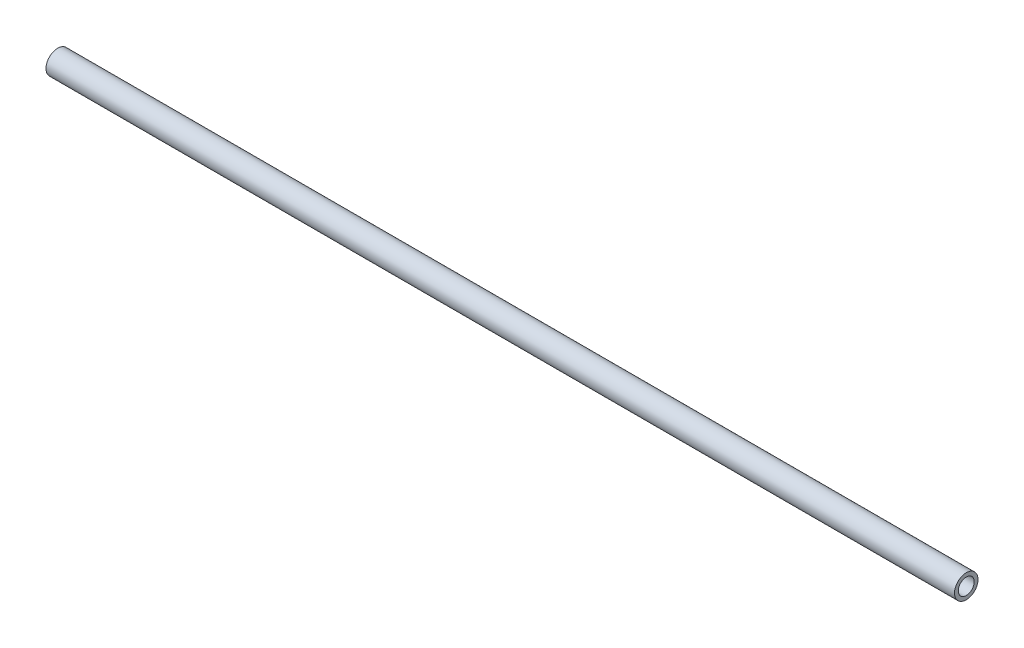
ISO-10303-21;
HEADER;
FILE_DESCRIPTION(('STEP AP214'),'2;1');
FILE_NAME('part.step','',(''),(''),'','','');
FILE_SCHEMA(('AUTOMOTIVE_DESIGN { 1 0 10303 214 1 1 1 1 }'));
ENDSEC;
DATA;
#1=APPLICATION_CONTEXT('core data for automotive mechanical design processes');
#2=APPLICATION_PROTOCOL_DEFINITION('international standard','automotive_design',2000,#1);
#3=PRODUCT_CONTEXT('',#1,'mechanical');
#4=PRODUCT('Part','Part','',(#3));
#5=PRODUCT_RELATED_PRODUCT_CATEGORY('part','',(#4));
#6=PRODUCT_DEFINITION_FORMATION('','',#4);
#7=PRODUCT_DEFINITION_CONTEXT('part definition',#1,'design');
#8=PRODUCT_DEFINITION('design','',#6,#7);
#9=PRODUCT_DEFINITION_SHAPE('','',#8);
#10=(LENGTH_UNIT() NAMED_UNIT(*) SI_UNIT(.MILLI.,.METRE.));
#11=(NAMED_UNIT(*) PLANE_ANGLE_UNIT() SI_UNIT($,.RADIAN.));
#12=(NAMED_UNIT(*) SI_UNIT($,.STERADIAN.) SOLID_ANGLE_UNIT());
#13=UNCERTAINTY_MEASURE_WITH_UNIT(LENGTH_MEASURE(1.E-05),#10,'distance_accuracy_value','');
#14=(GEOMETRIC_REPRESENTATION_CONTEXT(3) GLOBAL_UNCERTAINTY_ASSIGNED_CONTEXT((#13)) GLOBAL_UNIT_ASSIGNED_CONTEXT((#10,
#11,#12)) REPRESENTATION_CONTEXT('',''));
#15=CARTESIAN_POINT('',(0.,0.,0.));
#16=DIRECTION('',(0.,0.,1.));
#17=DIRECTION('',(1.,0.,0.));
#18=AXIS2_PLACEMENT_3D('',#15,#16,#17);
#19=CARTESIAN_POINT('',(-368.3,0.,0.));
#20=DIRECTION('',(1.,0.,0.));
#21=DIRECTION('',(0.,0.,-1.));
#22=AXIS2_PLACEMENT_3D('',#19,#20,#21);
#23=CYLINDRICAL_SURFACE('',#22,6.477);
#24=CARTESIAN_POINT('',(368.3,0.,0.));
#25=DIRECTION('',(1.,0.,0.));
#26=DIRECTION('',(0.,0.,-1.));
#27=AXIS2_PLACEMENT_3D('',#24,#25,#26);
#28=CIRCLE('',#27,6.477);
#29=CARTESIAN_POINT('',(368.3,0.,-6.477));
#30=VERTEX_POINT('',#29);
#31=EDGE_CURVE('E17',#30,#30,#28,.F.);
#32=ORIENTED_EDGE('',*,*,#31,.F.);
#33=EDGE_LOOP('',(#32));
#34=FACE_BOUND('',#33,.T.);
#35=CARTESIAN_POINT('',(-368.3,0.,0.));
#36=DIRECTION('',(1.,0.,0.));
#37=DIRECTION('',(0.,0.,-1.));
#38=AXIS2_PLACEMENT_3D('',#35,#36,#37);
#39=CIRCLE('',#38,6.477);
#40=CARTESIAN_POINT('',(-368.3,0.,-6.477));
#41=VERTEX_POINT('',#40);
#42=EDGE_CURVE('E26',#41,#41,#39,.F.);
#43=ORIENTED_EDGE('',*,*,#42,.T.);
#44=EDGE_LOOP('',(#43));
#45=FACE_BOUND('',#44,.T.);
#46=ADVANCED_FACE('F14',(#34,#45),#23,.F.);
#47=CARTESIAN_POINT('',(368.3,0.,0.));
#48=DIRECTION('',(1.,0.,0.));
#49=DIRECTION('',(0.,0.,-1.));
#50=AXIS2_PLACEMENT_3D('',#47,#48,#49);
#51=PLANE('',#50);
#52=ORIENTED_EDGE('',*,*,#31,.T.);
#53=EDGE_LOOP('',(#52));
#54=FACE_BOUND('',#53,.T.);
#55=CARTESIAN_POINT('',(368.3,0.,0.));
#56=DIRECTION('',(1.,0.,0.));
#57=DIRECTION('',(0.,0.,-1.));
#58=AXIS2_PLACEMENT_3D('',#55,#56,#57);
#59=CIRCLE('',#58,9.525);
#60=CARTESIAN_POINT('',(368.3,0.,-9.525));
#61=VERTEX_POINT('',#60);
#62=EDGE_CURVE('E21',#61,#61,#59,.F.);
#63=ORIENTED_EDGE('',*,*,#62,.F.);
#64=EDGE_LOOP('',(#63));
#65=FACE_BOUND('',#64,.T.);
#66=ADVANCED_FACE('F34',(#54,#65),#51,.T.);
#67=CARTESIAN_POINT('',(-368.3,0.,0.));
#68=DIRECTION('',(1.,0.,0.));
#69=DIRECTION('',(0.,0.,-1.));
#70=AXIS2_PLACEMENT_3D('',#67,#68,#69);
#71=PLANE('',#70);
#72=ORIENTED_EDGE('',*,*,#42,.F.);
#73=EDGE_LOOP('',(#72));
#74=FACE_BOUND('',#73,.T.);
#75=CARTESIAN_POINT('',(-368.3,0.,0.));
#76=DIRECTION('',(1.,0.,0.));
#77=DIRECTION('',(0.,0.,-1.));
#78=AXIS2_PLACEMENT_3D('',#75,#76,#77);
#79=CIRCLE('',#78,9.525);
#80=CARTESIAN_POINT('',(-368.3,0.,-9.525));
#81=VERTEX_POINT('',#80);
#82=EDGE_CURVE('E10',#81,#81,#79,.T.);
#83=ORIENTED_EDGE('',*,*,#82,.F.);
#84=EDGE_LOOP('',(#83));
#85=FACE_BOUND('',#84,.T.);
#86=ADVANCED_FACE('F42',(#74,#85),#71,.F.);
#87=CARTESIAN_POINT('',(-368.3,0.,0.));
#88=DIRECTION('',(1.,0.,0.));
#89=DIRECTION('',(0.,0.,-1.));
#90=AXIS2_PLACEMENT_3D('',#87,#88,#89);
#91=CYLINDRICAL_SURFACE('',#90,9.525);
#92=ORIENTED_EDGE('',*,*,#62,.T.);
#93=EDGE_LOOP('',(#92));
#94=FACE_BOUND('',#93,.T.);
#95=ORIENTED_EDGE('',*,*,#82,.T.);
#96=EDGE_LOOP('',(#95));
#97=FACE_BOUND('',#96,.T.);
#98=ADVANCED_FACE('F43',(#94,#97),#91,.T.);
#99=CLOSED_SHELL('',(#46,#66,#86,#98));
#100=MANIFOLD_SOLID_BREP('B1',#99);
#101=ADVANCED_BREP_SHAPE_REPRESENTATION('',(#18,#100),#14);
#102=SHAPE_DEFINITION_REPRESENTATION(#9,#101);
ENDSEC;
END-ISO-10303-21;
